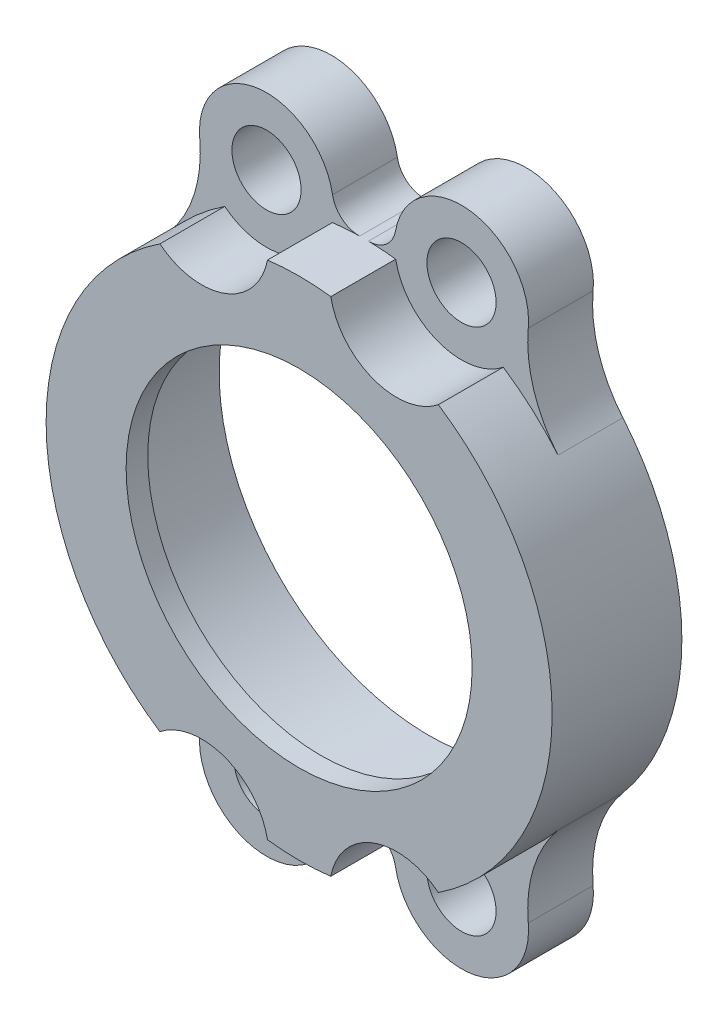
ISO-10303-21;
HEADER;
FILE_DESCRIPTION(('STEP AP214'),'2;1');
FILE_NAME('part.step','',(''),(''),'','','');
FILE_SCHEMA(('AUTOMOTIVE_DESIGN { 1 0 10303 214 1 1 1 1 }'));
ENDSEC;
DATA;
#1=APPLICATION_CONTEXT('core data for automotive mechanical design processes');
#2=APPLICATION_PROTOCOL_DEFINITION('international standard','automotive_design',2000,#1);
#3=PRODUCT_CONTEXT('',#1,'mechanical');
#4=PRODUCT('Part','Part','',(#3));
#5=PRODUCT_RELATED_PRODUCT_CATEGORY('part','',(#4));
#6=PRODUCT_DEFINITION_FORMATION('','',#4);
#7=PRODUCT_DEFINITION_CONTEXT('part definition',#1,'design');
#8=PRODUCT_DEFINITION('design','',#6,#7);
#9=PRODUCT_DEFINITION_SHAPE('','',#8);
#10=(LENGTH_UNIT() NAMED_UNIT(*) SI_UNIT(.MILLI.,.METRE.));
#11=(NAMED_UNIT(*) PLANE_ANGLE_UNIT() SI_UNIT($,.RADIAN.));
#12=(NAMED_UNIT(*) SI_UNIT($,.STERADIAN.) SOLID_ANGLE_UNIT());
#13=UNCERTAINTY_MEASURE_WITH_UNIT(LENGTH_MEASURE(1.E-05),#10,'distance_accuracy_value','');
#14=(GEOMETRIC_REPRESENTATION_CONTEXT(3) GLOBAL_UNCERTAINTY_ASSIGNED_CONTEXT((#13)) GLOBAL_UNIT_ASSIGNED_CONTEXT((#10,
#11,#12)) REPRESENTATION_CONTEXT('',''));
#15=CARTESIAN_POINT('',(0.,0.,0.));
#16=DIRECTION('',(0.,0.,1.));
#17=DIRECTION('',(1.,0.,0.));
#18=AXIS2_PLACEMENT_3D('',#15,#16,#17);
#19=CARTESIAN_POINT('',(-4.50880281690145,-12.1930593846788,-5.));
#20=DIRECTION('',(0.,0.,1.));
#21=DIRECTION('',(1.,0.,0.));
#22=AXIS2_PLACEMENT_3D('',#19,#20,#21);
#23=CYLINDRICAL_SURFACE('',#22,3.1);
#24=DIRECTION('',(0.,0.,1.));
#25=VECTOR('',#24,1.);
#26=CARTESIAN_POINT('',(-1.45585096363241,-12.7310974703392,-5.));
#27=LINE('',#26,#25);
#28=CARTESIAN_POINT('',(-1.45585096363241,-12.7310974703392,-5.));
#29=VERTEX_POINT('',#28);
#30=CARTESIAN_POINT('',(-1.45585096363241,-12.7310974703392,-2.));
#31=VERTEX_POINT('',#30);
#32=EDGE_CURVE('E230',#29,#31,#27,.T.);
#33=ORIENTED_EDGE('',*,*,#32,.T.);
#34=CARTESIAN_POINT('',(-4.50880281690145,-12.1930593846788,-2.));
#35=DIRECTION('',(0.,0.,1.));
#36=DIRECTION('',(1.,0.,0.));
#37=AXIS2_PLACEMENT_3D('',#34,#35,#36);
#38=CIRCLE('',#37,3.1);
#39=CARTESIAN_POINT('',(-7.59588423001124,-11.9103433631447,-2.));
#40=VERTEX_POINT('',#39);
#41=EDGE_CURVE('E268',#40,#31,#38,.T.);
#42=ORIENTED_EDGE('',*,*,#41,.F.);
#43=DIRECTION('',(0.,0.,1.));
#44=VECTOR('',#43,1.);
#45=CARTESIAN_POINT('',(-7.59588423001124,-11.9103433631447,-5.));
#46=LINE('',#45,#44);
#47=CARTESIAN_POINT('',(-7.59588423001124,-11.9103433631447,-5.));
#48=VERTEX_POINT('',#47);
#49=EDGE_CURVE('E259',#40,#48,#46,.F.);
#50=ORIENTED_EDGE('',*,*,#49,.T.);
#51=CARTESIAN_POINT('',(-4.50880281690145,-12.1930593846788,-5.));
#52=DIRECTION('',(0.,0.,1.));
#53=DIRECTION('',(1.,0.,0.));
#54=AXIS2_PLACEMENT_3D('',#51,#52,#53);
#55=CIRCLE('',#54,3.1);
#56=EDGE_CURVE('E249',#48,#29,#55,.T.);
#57=ORIENTED_EDGE('',*,*,#56,.T.);
#58=EDGE_LOOP('',(#33,#42,#50,#57));
#59=FACE_BOUND('',#58,.T.);
#60=ADVANCED_FACE('F34',(#59),#23,.T.);
#61=CARTESIAN_POINT('',(-4.50880281690145,12.1930593846787,-5.));
#62=DIRECTION('',(0.,0.,1.));
#63=DIRECTION('',(1.,0.,0.));
#64=AXIS2_PLACEMENT_3D('',#61,#62,#63);
#65=CYLINDRICAL_SURFACE('',#64,3.1);
#66=DIRECTION('',(0.,0.,1.));
#67=VECTOR('',#66,1.);
#68=CARTESIAN_POINT('',(-7.59588423001125,11.9103433631446,-5.));
#69=LINE('',#68,#67);
#70=CARTESIAN_POINT('',(-7.59588423001125,11.9103433631446,-5.));
#71=VERTEX_POINT('',#70);
#72=CARTESIAN_POINT('',(-7.59588423001124,11.9103433631446,-2.));
#73=VERTEX_POINT('',#72);
#74=EDGE_CURVE('E370',#71,#73,#69,.T.);
#75=ORIENTED_EDGE('',*,*,#74,.T.);
#76=CARTESIAN_POINT('',(-4.50880281690145,12.1930593846787,-2.));
#77=DIRECTION('',(0.,0.,1.));
#78=DIRECTION('',(1.,0.,0.));
#79=AXIS2_PLACEMENT_3D('',#76,#77,#78);
#80=CIRCLE('',#79,3.1);
#81=CARTESIAN_POINT('',(-1.45585096363242,12.7310974703392,-2.));
#82=VERTEX_POINT('',#81);
#83=EDGE_CURVE('E433',#82,#73,#80,.T.);
#84=ORIENTED_EDGE('',*,*,#83,.F.);
#85=DIRECTION('',(0.,0.,1.));
#86=VECTOR('',#85,1.);
#87=CARTESIAN_POINT('',(-1.45585096363242,12.7310974703392,-5.));
#88=LINE('',#87,#86);
#89=CARTESIAN_POINT('',(-1.45585096363242,12.7310974703392,-5.));
#90=VERTEX_POINT('',#89);
#91=EDGE_CURVE('E220',#82,#90,#88,.F.);
#92=ORIENTED_EDGE('',*,*,#91,.T.);
#93=CARTESIAN_POINT('',(-4.50880281690145,12.1930593846787,-5.));
#94=DIRECTION('',(0.,0.,1.));
#95=DIRECTION('',(1.,0.,0.));
#96=AXIS2_PLACEMENT_3D('',#93,#94,#95);
#97=CIRCLE('',#96,3.1);
#98=EDGE_CURVE('E343',#90,#71,#97,.T.);
#99=ORIENTED_EDGE('',*,*,#98,.T.);
#100=EDGE_LOOP('',(#75,#84,#92,#99));
#101=FACE_BOUND('',#100,.T.);
#102=ADVANCED_FACE('F516',(#101),#65,.T.);
#103=CARTESIAN_POINT('',(4.50880281690123,12.1930593846787,-5.));
#104=DIRECTION('',(0.,0.,1.));
#105=DIRECTION('',(1.,0.,0.));
#106=AXIS2_PLACEMENT_3D('',#103,#104,#105);
#107=CYLINDRICAL_SURFACE('',#106,3.1);
#108=DIRECTION('',(0.,0.,1.));
#109=VECTOR('',#108,1.);
#110=CARTESIAN_POINT('',(1.4558509636322,12.7310974703392,-5.));
#111=LINE('',#110,#109);
#112=CARTESIAN_POINT('',(1.4558509636322,12.7310974703392,-5.));
#113=VERTEX_POINT('',#112);
#114=CARTESIAN_POINT('',(1.4558509636322,12.7310974703392,-2.));
#115=VERTEX_POINT('',#114);
#116=EDGE_CURVE('E228',#113,#115,#111,.T.);
#117=ORIENTED_EDGE('',*,*,#116,.T.);
#118=CARTESIAN_POINT('',(4.50880281690123,12.1930593846787,-2.));
#119=DIRECTION('',(0.,0.,1.));
#120=DIRECTION('',(1.,0.,0.));
#121=AXIS2_PLACEMENT_3D('',#118,#119,#120);
#122=CIRCLE('',#121,3.1);
#123=CARTESIAN_POINT('',(7.59588423001103,11.9103433631447,-2.));
#124=VERTEX_POINT('',#123);
#125=EDGE_CURVE('E57',#124,#115,#122,.T.);
#126=ORIENTED_EDGE('',*,*,#125,.F.);
#127=DIRECTION('',(0.,0.,1.));
#128=VECTOR('',#127,1.);
#129=CARTESIAN_POINT('',(7.59588423001103,11.9103433631447,-5.));
#130=LINE('',#129,#128);
#131=CARTESIAN_POINT('',(7.59588423001103,11.9103433631447,-5.));
#132=VERTEX_POINT('',#131);
#133=EDGE_CURVE('E368',#124,#132,#130,.F.);
#134=ORIENTED_EDGE('',*,*,#133,.T.);
#135=CARTESIAN_POINT('',(4.50880281690123,12.1930593846787,-5.));
#136=DIRECTION('',(0.,0.,1.));
#137=DIRECTION('',(1.,0.,0.));
#138=AXIS2_PLACEMENT_3D('',#135,#136,#137);
#139=CIRCLE('',#138,3.1);
#140=EDGE_CURVE('E340',#132,#113,#139,.T.);
#141=ORIENTED_EDGE('',*,*,#140,.T.);
#142=EDGE_LOOP('',(#117,#126,#134,#141));
#143=FACE_BOUND('',#142,.T.);
#144=ADVANCED_FACE('F521',(#143),#107,.T.);
#145=CARTESIAN_POINT('',(4.50880281690123,-12.1930593846788,-5.));
#146=DIRECTION('',(0.,0.,1.));
#147=DIRECTION('',(1.,0.,0.));
#148=AXIS2_PLACEMENT_3D('',#145,#146,#147);
#149=CYLINDRICAL_SURFACE('',#148,3.1);
#150=DIRECTION('',(0.,0.,1.));
#151=VECTOR('',#150,1.);
#152=CARTESIAN_POINT('',(7.59588423001103,-11.9103433631448,-5.));
#153=LINE('',#152,#151);
#154=CARTESIAN_POINT('',(7.59588423001103,-11.9103433631448,-5.));
#155=VERTEX_POINT('',#154);
#156=CARTESIAN_POINT('',(7.59588423001103,-11.9103433631448,-2.));
#157=VERTEX_POINT('',#156);
#158=EDGE_CURVE('E379',#155,#157,#153,.T.);
#159=ORIENTED_EDGE('',*,*,#158,.T.);
#160=CARTESIAN_POINT('',(4.50880281690123,-12.1930593846788,-2.));
#161=DIRECTION('',(0.,0.,1.));
#162=DIRECTION('',(1.,0.,0.));
#163=AXIS2_PLACEMENT_3D('',#160,#161,#162);
#164=CIRCLE('',#163,3.1);
#165=CARTESIAN_POINT('',(1.45585096363219,-12.7310974703392,-2.));
#166=VERTEX_POINT('',#165);
#167=EDGE_CURVE('E457',#166,#157,#164,.T.);
#168=ORIENTED_EDGE('',*,*,#167,.F.);
#169=DIRECTION('',(0.,0.,1.));
#170=VECTOR('',#169,1.);
#171=CARTESIAN_POINT('',(1.45585096363219,-12.7310974703392,-5.));
#172=LINE('',#171,#170);
#173=CARTESIAN_POINT('',(1.45585096363219,-12.7310974703392,-5.));
#174=VERTEX_POINT('',#173);
#175=EDGE_CURVE('E238',#166,#174,#172,.F.);
#176=ORIENTED_EDGE('',*,*,#175,.T.);
#177=CARTESIAN_POINT('',(4.50880281690123,-12.1930593846788,-5.));
#178=DIRECTION('',(0.,0.,1.));
#179=DIRECTION('',(1.,0.,0.));
#180=AXIS2_PLACEMENT_3D('',#177,#178,#179);
#181=CIRCLE('',#180,3.1);
#182=EDGE_CURVE('E336',#174,#155,#181,.T.);
#183=ORIENTED_EDGE('',*,*,#182,.T.);
#184=EDGE_LOOP('',(#159,#168,#176,#183));
#185=FACE_BOUND('',#184,.T.);
#186=ADVANCED_FACE('F481',(#185),#149,.T.);
#187=CARTESIAN_POINT('',(-4.50880281690145,12.1930593846787,-5.));
#188=DIRECTION('',(0.,0.,1.));
#189=DIRECTION('',(1.,0.,0.));
#190=AXIS2_PLACEMENT_3D('',#187,#188,#189);
#191=CYLINDRICAL_SURFACE('',#190,1.6);
#192=CARTESIAN_POINT('',(-4.50880281690145,12.1930593846787,-5.));
#193=DIRECTION('',(0.,0.,1.));
#194=DIRECTION('',(1.,0.,0.));
#195=AXIS2_PLACEMENT_3D('',#192,#193,#194);
#196=CIRCLE('',#195,1.6);
#197=CARTESIAN_POINT('',(-2.90880281690145,12.1930593846787,-5.));
#198=VERTEX_POINT('',#197);
#199=EDGE_CURVE('E355',#198,#198,#196,.T.);
#200=ORIENTED_EDGE('',*,*,#199,.F.);
#201=EDGE_LOOP('',(#200));
#202=FACE_BOUND('',#201,.T.);
#203=CARTESIAN_POINT('',(-4.50880281690145,12.1930593846787,-2.));
#204=DIRECTION('',(0.,0.,1.));
#205=DIRECTION('',(1.,0.,0.));
#206=AXIS2_PLACEMENT_3D('',#203,#204,#205);
#207=CIRCLE('',#206,1.6);
#208=CARTESIAN_POINT('',(-2.90880281690145,12.1930593846787,-2.));
#209=VERTEX_POINT('',#208);
#210=EDGE_CURVE('E294',#209,#209,#207,.F.);
#211=ORIENTED_EDGE('',*,*,#210,.F.);
#212=EDGE_LOOP('',(#211));
#213=FACE_BOUND('',#212,.T.);
#214=ADVANCED_FACE('F511',(#202,#213),#191,.F.);
#215=CARTESIAN_POINT('',(4.50880281690123,12.1930593846787,-5.));
#216=DIRECTION('',(0.,0.,1.));
#217=DIRECTION('',(1.,0.,0.));
#218=AXIS2_PLACEMENT_3D('',#215,#216,#217);
#219=CYLINDRICAL_SURFACE('',#218,1.6);
#220=CARTESIAN_POINT('',(4.50880281690123,12.1930593846787,-5.));
#221=DIRECTION('',(0.,0.,1.));
#222=DIRECTION('',(1.,0.,0.));
#223=AXIS2_PLACEMENT_3D('',#220,#221,#222);
#224=CIRCLE('',#223,1.6);
#225=CARTESIAN_POINT('',(6.10880281690124,12.1930593846787,-5.));
#226=VERTEX_POINT('',#225);
#227=EDGE_CURVE('E352',#226,#226,#224,.T.);
#228=ORIENTED_EDGE('',*,*,#227,.F.);
#229=EDGE_LOOP('',(#228));
#230=FACE_BOUND('',#229,.T.);
#231=CARTESIAN_POINT('',(4.50880281690123,12.1930593846787,-2.));
#232=DIRECTION('',(0.,0.,1.));
#233=DIRECTION('',(1.,0.,0.));
#234=AXIS2_PLACEMENT_3D('',#231,#232,#233);
#235=CIRCLE('',#234,1.6);
#236=CARTESIAN_POINT('',(6.10880281690124,12.1930593846787,-2.));
#237=VERTEX_POINT('',#236);
#238=EDGE_CURVE('E291',#237,#237,#235,.F.);
#239=ORIENTED_EDGE('',*,*,#238,.F.);
#240=EDGE_LOOP('',(#239));
#241=FACE_BOUND('',#240,.T.);
#242=ADVANCED_FACE('F502',(#230,#241),#219,.F.);
#243=CARTESIAN_POINT('',(4.50880281690123,-12.1930593846788,-5.));
#244=DIRECTION('',(0.,0.,1.));
#245=DIRECTION('',(1.,0.,0.));
#246=AXIS2_PLACEMENT_3D('',#243,#244,#245);
#247=CYLINDRICAL_SURFACE('',#246,1.6);
#248=CARTESIAN_POINT('',(4.50880281690123,-12.1930593846788,-5.));
#249=DIRECTION('',(0.,0.,1.));
#250=DIRECTION('',(1.,0.,0.));
#251=AXIS2_PLACEMENT_3D('',#248,#249,#250);
#252=CIRCLE('',#251,1.6);
#253=CARTESIAN_POINT('',(6.10880281690124,-12.1930593846788,-5.));
#254=VERTEX_POINT('',#253);
#255=EDGE_CURVE('E349',#254,#254,#252,.T.);
#256=ORIENTED_EDGE('',*,*,#255,.F.);
#257=EDGE_LOOP('',(#256));
#258=FACE_BOUND('',#257,.T.);
#259=CARTESIAN_POINT('',(4.50880281690123,-12.1930593846788,-2.));
#260=DIRECTION('',(0.,0.,1.));
#261=DIRECTION('',(1.,0.,0.));
#262=AXIS2_PLACEMENT_3D('',#259,#260,#261);
#263=CIRCLE('',#262,1.6);
#264=CARTESIAN_POINT('',(6.10880281690124,-12.1930593846788,-2.));
#265=VERTEX_POINT('',#264);
#266=EDGE_CURVE('E285',#265,#265,#263,.F.);
#267=ORIENTED_EDGE('',*,*,#266,.F.);
#268=EDGE_LOOP('',(#267));
#269=FACE_BOUND('',#268,.T.);
#270=ADVANCED_FACE('F499',(#258,#269),#247,.F.);
#271=CARTESIAN_POINT('',(-4.50880281690145,-12.1930593846788,-5.));
#272=DIRECTION('',(0.,0.,1.));
#273=DIRECTION('',(1.,0.,0.));
#274=AXIS2_PLACEMENT_3D('',#271,#272,#273);
#275=CYLINDRICAL_SURFACE('',#274,1.5);
#276=CARTESIAN_POINT('',(-4.50880281690145,-12.1930593846788,-5.));
#277=DIRECTION('',(0.,0.,1.));
#278=DIRECTION('',(1.,0.,0.));
#279=AXIS2_PLACEMENT_3D('',#276,#277,#278);
#280=CIRCLE('',#279,1.5);
#281=CARTESIAN_POINT('',(-3.00880281690145,-12.1930593846788,-5.));
#282=VERTEX_POINT('',#281);
#283=EDGE_CURVE('E346',#282,#282,#280,.T.);
#284=ORIENTED_EDGE('',*,*,#283,.F.);
#285=EDGE_LOOP('',(#284));
#286=FACE_BOUND('',#285,.T.);
#287=CARTESIAN_POINT('',(-4.50880281690145,-12.1930593846788,-2.));
#288=DIRECTION('',(0.,0.,1.));
#289=DIRECTION('',(1.,0.,0.));
#290=AXIS2_PLACEMENT_3D('',#287,#288,#289);
#291=CIRCLE('',#290,1.5);
#292=CARTESIAN_POINT('',(-3.00880281690145,-12.1930593846788,-2.));
#293=VERTEX_POINT('',#292);
#294=EDGE_CURVE('E288',#293,#293,#291,.F.);
#295=ORIENTED_EDGE('',*,*,#294,.F.);
#296=EDGE_LOOP('',(#295));
#297=FACE_BOUND('',#296,.T.);
#298=ADVANCED_FACE('F501',(#286,#297),#275,.F.);
#299=CARTESIAN_POINT('',(13.5708805134493,11.3631510634014,-5.));
#300=DIRECTION('',(0.,0.,-1.));
#301=DIRECTION('',(-1.,0.,0.));
#302=AXIS2_PLACEMENT_3D('',#299,#300,#301);
#303=CYLINDRICAL_SURFACE('',#302,6.);
#304=CARTESIAN_POINT('',(13.5708805134493,11.3631510634014,-2.));
#305=DIRECTION('',(0.,0.,1.));
#306=DIRECTION('',(1.,0.,0.));
#307=AXIS2_PLACEMENT_3D('',#304,#305,#306);
#308=CIRCLE('',#307,6.);
#309=CARTESIAN_POINT('',(8.97058203431397,7.51123544868907,-2.));
#310=VERTEX_POINT('',#309);
#311=EDGE_CURVE('E460',#124,#310,#308,.T.);
#312=ORIENTED_EDGE('',*,*,#311,.T.);
#313=DIRECTION('',(0.,0.,1.));
#314=VECTOR('',#313,1.);
#315=CARTESIAN_POINT('',(8.97058203431397,7.51123544868908,-5.));
#316=LINE('',#315,#314);
#317=CARTESIAN_POINT('',(8.97058203431397,7.51123544868908,-5.));
#318=VERTEX_POINT('',#317);
#319=EDGE_CURVE('E365',#318,#310,#316,.T.);
#320=ORIENTED_EDGE('',*,*,#319,.F.);
#321=CARTESIAN_POINT('',(13.5708805134493,11.3631510634014,-5.));
#322=DIRECTION('',(0.,0.,1.));
#323=DIRECTION('',(1.,0.,0.));
#324=AXIS2_PLACEMENT_3D('',#321,#322,#323);
#325=CIRCLE('',#324,6.);
#326=EDGE_CURVE('E382',#132,#318,#325,.T.);
#327=ORIENTED_EDGE('',*,*,#326,.F.);
#328=ORIENTED_EDGE('',*,*,#133,.F.);
#329=EDGE_LOOP('',(#312,#320,#327,#328));
#330=FACE_BOUND('',#329,.T.);
#331=ADVANCED_FACE('F467',(#330),#303,.F.);
#332=CARTESIAN_POINT('',(-13.5708805134495,11.3631510634012,-5.));
#333=DIRECTION('',(0.,0.,-1.));
#334=DIRECTION('',(-1.,0.,0.));
#335=AXIS2_PLACEMENT_3D('',#332,#333,#334);
#336=CYLINDRICAL_SURFACE('',#335,6.);
#337=CARTESIAN_POINT('',(-13.5708805134495,11.3631510634012,-2.));
#338=DIRECTION('',(0.,0.,1.));
#339=DIRECTION('',(1.,0.,0.));
#340=AXIS2_PLACEMENT_3D('',#337,#338,#339);
#341=CIRCLE('',#340,6.);
#342=CARTESIAN_POINT('',(-8.97058203431411,7.51123544868892,-2.));
#343=VERTEX_POINT('',#342);
#344=EDGE_CURVE('E431',#343,#73,#341,.T.);
#345=ORIENTED_EDGE('',*,*,#344,.T.);
#346=ORIENTED_EDGE('',*,*,#74,.F.);
#347=CARTESIAN_POINT('',(-13.5708805134495,11.3631510634012,-5.));
#348=DIRECTION('',(0.,0.,1.));
#349=DIRECTION('',(1.,0.,0.));
#350=AXIS2_PLACEMENT_3D('',#347,#348,#349);
#351=CIRCLE('',#350,6.);
#352=CARTESIAN_POINT('',(-8.97058203431411,7.51123544868892,-5.));
#353=VERTEX_POINT('',#352);
#354=EDGE_CURVE('E384',#353,#71,#351,.T.);
#355=ORIENTED_EDGE('',*,*,#354,.F.);
#356=DIRECTION('',(0.,0.,1.));
#357=VECTOR('',#356,1.);
#358=CARTESIAN_POINT('',(-8.97058203431411,7.51123544868892,-5.));
#359=LINE('',#358,#357);
#360=EDGE_CURVE('E376',#343,#353,#359,.F.);
#361=ORIENTED_EDGE('',*,*,#360,.F.);
#362=EDGE_LOOP('',(#345,#346,#355,#361));
#363=FACE_BOUND('',#362,.T.);
#364=ADVANCED_FACE('F529',(#363),#336,.F.);
#365=CARTESIAN_POINT('',(-13.5708805134495,-11.3631510634012,-5.));
#366=DIRECTION('',(0.,0.,-1.));
#367=DIRECTION('',(-1.,0.,0.));
#368=AXIS2_PLACEMENT_3D('',#365,#366,#367);
#369=CYLINDRICAL_SURFACE('',#368,6.);
#370=CARTESIAN_POINT('',(-13.5708805134495,-11.3631510634012,-2.));
#371=DIRECTION('',(0.,0.,1.));
#372=DIRECTION('',(1.,0.,0.));
#373=AXIS2_PLACEMENT_3D('',#370,#371,#372);
#374=CIRCLE('',#373,6.);
#375=CARTESIAN_POINT('',(-8.97058203431411,-7.51123544868891,-2.));
#376=VERTEX_POINT('',#375);
#377=EDGE_CURVE('E271',#40,#376,#374,.T.);
#378=ORIENTED_EDGE('',*,*,#377,.T.);
#379=DIRECTION('',(0.,0.,1.));
#380=VECTOR('',#379,1.);
#381=CARTESIAN_POINT('',(-8.9705820343141,-7.51123544868892,-5.));
#382=LINE('',#381,#380);
#383=CARTESIAN_POINT('',(-8.9705820343141,-7.51123544868892,-5.));
#384=VERTEX_POINT('',#383);
#385=EDGE_CURVE('E373',#384,#376,#382,.T.);
#386=ORIENTED_EDGE('',*,*,#385,.F.);
#387=CARTESIAN_POINT('',(-13.5708805134495,-11.3631510634012,-5.));
#388=DIRECTION('',(0.,0.,1.));
#389=DIRECTION('',(1.,0.,0.));
#390=AXIS2_PLACEMENT_3D('',#387,#388,#389);
#391=CIRCLE('',#390,6.);
#392=EDGE_CURVE('E223',#48,#384,#391,.T.);
#393=ORIENTED_EDGE('',*,*,#392,.F.);
#394=ORIENTED_EDGE('',*,*,#49,.F.);
#395=EDGE_LOOP('',(#378,#386,#393,#394));
#396=FACE_BOUND('',#395,.T.);
#397=ADVANCED_FACE('F394',(#396),#369,.F.);
#398=CARTESIAN_POINT('',(13.5708805134493,-11.3631510634014,-5.));
#399=DIRECTION('',(0.,0.,-1.));
#400=DIRECTION('',(-1.,0.,0.));
#401=AXIS2_PLACEMENT_3D('',#398,#399,#400);
#402=CYLINDRICAL_SURFACE('',#401,6.);
#403=CARTESIAN_POINT('',(13.5708805134493,-11.3631510634014,-2.));
#404=DIRECTION('',(0.,0.,1.));
#405=DIRECTION('',(1.,0.,0.));
#406=AXIS2_PLACEMENT_3D('',#403,#404,#405);
#407=CIRCLE('',#406,6.);
#408=CARTESIAN_POINT('',(8.97058203431397,-7.51123544868908,-2.));
#409=VERTEX_POINT('',#408);
#410=EDGE_CURVE('E454',#409,#157,#407,.T.);
#411=ORIENTED_EDGE('',*,*,#410,.T.);
#412=ORIENTED_EDGE('',*,*,#158,.F.);
#413=CARTESIAN_POINT('',(13.5708805134493,-11.3631510634014,-5.));
#414=DIRECTION('',(0.,0.,1.));
#415=DIRECTION('',(1.,0.,0.));
#416=AXIS2_PLACEMENT_3D('',#413,#414,#415);
#417=CIRCLE('',#416,6.);
#418=CARTESIAN_POINT('',(8.97058203431397,-7.51123544868908,-5.));
#419=VERTEX_POINT('',#418);
#420=EDGE_CURVE('E217',#419,#155,#417,.T.);
#421=ORIENTED_EDGE('',*,*,#420,.F.);
#422=DIRECTION('',(0.,0.,1.));
#423=VECTOR('',#422,1.);
#424=CARTESIAN_POINT('',(8.97058203431397,-7.51123544868908,-5.));
#425=LINE('',#424,#423);
#426=EDGE_CURVE('E361',#409,#419,#425,.F.);
#427=ORIENTED_EDGE('',*,*,#426,.F.);
#428=EDGE_LOOP('',(#411,#412,#421,#427));
#429=FACE_BOUND('',#428,.T.);
#430=ADVANCED_FACE('F477',(#429),#402,.F.);
#431=CARTESIAN_POINT('',(-0.224821990540071,12.9480483113313,-5.));
#432=DIRECTION('',(0.,0.,-1.));
#433=DIRECTION('',(-1.,0.,0.));
#434=AXIS2_PLACEMENT_3D('',#431,#432,#433);
#435=CYLINDRICAL_SURFACE('',#434,1.25);
#436=CARTESIAN_POINT('',(-0.224821990540071,12.9480483113313,-2.));
#437=DIRECTION('',(0.,0.,1.));
#438=DIRECTION('',(1.,0.,0.));
#439=AXIS2_PLACEMENT_3D('',#436,#437,#438);
#440=CIRCLE('',#439,1.25);
#441=CARTESIAN_POINT('',(-0.203121026202226,11.6982366982684,-2.));
#442=VERTEX_POINT('',#441);
#443=EDGE_CURVE('E438',#82,#442,#440,.T.);
#444=ORIENTED_EDGE('',*,*,#443,.T.);
#445=DIRECTION('',(0.,0.,1.));
#446=VECTOR('',#445,1.);
#447=CARTESIAN_POINT('',(-0.203121026202226,11.6982366982684,-5.));
#448=LINE('',#447,#446);
#449=CARTESIAN_POINT('',(-0.203121026202226,11.6982366982684,-5.));
#450=VERTEX_POINT('',#449);
#451=EDGE_CURVE('E216',#450,#442,#448,.T.);
#452=ORIENTED_EDGE('',*,*,#451,.F.);
#453=CARTESIAN_POINT('',(-0.224821990540071,12.9480483113313,-5.));
#454=DIRECTION('',(0.,0.,1.));
#455=DIRECTION('',(1.,0.,0.));
#456=AXIS2_PLACEMENT_3D('',#453,#454,#455);
#457=CIRCLE('',#456,1.25);
#458=EDGE_CURVE('E240',#90,#450,#457,.T.);
#459=ORIENTED_EDGE('',*,*,#458,.F.);
#460=ORIENTED_EDGE('',*,*,#91,.F.);
#461=EDGE_LOOP('',(#444,#452,#459,#460));
#462=FACE_BOUND('',#461,.T.);
#463=ADVANCED_FACE('F537',(#462),#435,.F.);
#464=CARTESIAN_POINT('',(0.224821990539853,12.9480483113313,-5.));
#465=DIRECTION('',(0.,0.,-1.));
#466=DIRECTION('',(-1.,0.,0.));
#467=AXIS2_PLACEMENT_3D('',#464,#465,#466);
#468=CYLINDRICAL_SURFACE('',#467,1.25);
#469=CARTESIAN_POINT('',(0.224821990539853,12.9480483113313,-2.));
#470=DIRECTION('',(0.,0.,1.));
#471=DIRECTION('',(1.,0.,0.));
#472=AXIS2_PLACEMENT_3D('',#469,#470,#471);
#473=CIRCLE('',#472,1.25);
#474=CARTESIAN_POINT('',(0.203121026202029,11.6982366982684,-2.));
#475=VERTEX_POINT('',#474);
#476=EDGE_CURVE('E193',#475,#115,#473,.T.);
#477=ORIENTED_EDGE('',*,*,#476,.T.);
#478=ORIENTED_EDGE('',*,*,#116,.F.);
#479=CARTESIAN_POINT('',(0.224821990539853,12.9480483113313,-5.));
#480=DIRECTION('',(0.,0.,1.));
#481=DIRECTION('',(1.,0.,0.));
#482=AXIS2_PLACEMENT_3D('',#479,#480,#481);
#483=CIRCLE('',#482,1.25);
#484=CARTESIAN_POINT('',(0.20312102620203,11.6982366982684,-5.));
#485=VERTEX_POINT('',#484);
#486=EDGE_CURVE('E215',#485,#113,#483,.T.);
#487=ORIENTED_EDGE('',*,*,#486,.F.);
#488=DIRECTION('',(0.,0.,1.));
#489=VECTOR('',#488,1.);
#490=CARTESIAN_POINT('',(0.20312102620203,11.6982366982684,-5.));
#491=LINE('',#490,#489);
#492=EDGE_CURVE('E208',#475,#485,#491,.F.);
#493=ORIENTED_EDGE('',*,*,#492,.F.);
#494=EDGE_LOOP('',(#477,#478,#487,#493));
#495=FACE_BOUND('',#494,.T.);
#496=ADVANCED_FACE('F214',(#495),#468,.F.);
#497=CARTESIAN_POINT('',(-0.224821990540053,-12.9480483113313,-5.));
#498=DIRECTION('',(0.,0.,-1.));
#499=DIRECTION('',(-1.,0.,0.));
#500=AXIS2_PLACEMENT_3D('',#497,#498,#499);
#501=CYLINDRICAL_SURFACE('',#500,1.25);
#502=CARTESIAN_POINT('',(-0.224821990540053,-12.9480483113313,-2.));
#503=DIRECTION('',(0.,0.,1.));
#504=DIRECTION('',(1.,0.,0.));
#505=AXIS2_PLACEMENT_3D('',#502,#503,#504);
#506=CIRCLE('',#505,1.25);
#507=CARTESIAN_POINT('',(-0.203121026202219,-11.6982366982684,-2.));
#508=VERTEX_POINT('',#507);
#509=EDGE_CURVE('E264',#508,#31,#506,.T.);
#510=ORIENTED_EDGE('',*,*,#509,.T.);
#511=ORIENTED_EDGE('',*,*,#32,.F.);
#512=CARTESIAN_POINT('',(-0.224821990540053,-12.9480483113313,-5.));
#513=DIRECTION('',(0.,0.,1.));
#514=DIRECTION('',(1.,0.,0.));
#515=AXIS2_PLACEMENT_3D('',#512,#513,#514);
#516=CIRCLE('',#515,1.25);
#517=CARTESIAN_POINT('',(-0.20312102620221,-11.6982366982684,-5.));
#518=VERTEX_POINT('',#517);
#519=EDGE_CURVE('E42',#518,#29,#516,.T.);
#520=ORIENTED_EDGE('',*,*,#519,.F.);
#521=DIRECTION('',(0.,0.,1.));
#522=VECTOR('',#521,1.);
#523=CARTESIAN_POINT('',(-0.20312102620221,-11.6982366982684,-5.));
#524=LINE('',#523,#522);
#525=EDGE_CURVE('E236',#508,#518,#524,.F.);
#526=ORIENTED_EDGE('',*,*,#525,.F.);
#527=EDGE_LOOP('',(#510,#511,#520,#526));
#528=FACE_BOUND('',#527,.T.);
#529=ADVANCED_FACE('F263',(#528),#501,.F.);
#530=CARTESIAN_POINT('',(0.224821990539831,-12.9480483113313,-5.));
#531=DIRECTION('',(0.,0.,-1.));
#532=DIRECTION('',(-1.,0.,0.));
#533=AXIS2_PLACEMENT_3D('',#530,#531,#532);
#534=CYLINDRICAL_SURFACE('',#533,1.25);
#535=CARTESIAN_POINT('',(0.224821990539831,-12.9480483113313,-2.));
#536=DIRECTION('',(0.,0.,1.));
#537=DIRECTION('',(1.,0.,0.));
#538=AXIS2_PLACEMENT_3D('',#535,#536,#537);
#539=CIRCLE('',#538,1.25);
#540=CARTESIAN_POINT('',(0.203121026202009,-11.6982366982684,-2.));
#541=VERTEX_POINT('',#540);
#542=EDGE_CURVE('E273',#166,#541,#539,.T.);
#543=ORIENTED_EDGE('',*,*,#542,.T.);
#544=DIRECTION('',(0.,0.,1.));
#545=VECTOR('',#544,1.);
#546=CARTESIAN_POINT('',(0.203121026202009,-11.6982366982684,-5.));
#547=LINE('',#546,#545);
#548=CARTESIAN_POINT('',(0.203121026202009,-11.6982366982684,-5.));
#549=VERTEX_POINT('',#548);
#550=EDGE_CURVE('E233',#549,#541,#547,.T.);
#551=ORIENTED_EDGE('',*,*,#550,.F.);
#552=CARTESIAN_POINT('',(0.224821990539831,-12.9480483113313,-5.));
#553=DIRECTION('',(0.,0.,1.));
#554=DIRECTION('',(1.,0.,0.));
#555=AXIS2_PLACEMENT_3D('',#552,#553,#554);
#556=CIRCLE('',#555,1.25);
#557=EDGE_CURVE('E11',#174,#549,#556,.T.);
#558=ORIENTED_EDGE('',*,*,#557,.F.);
#559=ORIENTED_EDGE('',*,*,#175,.F.);
#560=EDGE_LOOP('',(#543,#551,#558,#559));
#561=FACE_BOUND('',#560,.T.);
#562=ADVANCED_FACE('F36',(#561),#534,.F.);
#563=CARTESIAN_POINT('',(0.,0.,-5.));
#564=DIRECTION('',(0.,0.,1.));
#565=DIRECTION('',(1.,0.,0.));
#566=AXIS2_PLACEMENT_3D('',#563,#564,#565);
#567=CYLINDRICAL_SURFACE('',#566,11.7);
#568=CARTESIAN_POINT('',(0.,0.,-2.));
#569=DIRECTION('',(0.,0.,1.));
#570=DIRECTION('',(1.,0.,0.));
#571=AXIS2_PLACEMENT_3D('',#568,#569,#570);
#572=CIRCLE('',#571,11.7);
#573=CARTESIAN_POINT('',(-6.44002888592919,-9.76811281406995,-2.));
#574=VERTEX_POINT('',#573);
#575=EDGE_CURVE('E279',#376,#574,#572,.T.);
#576=ORIENTED_EDGE('',*,*,#575,.T.);
#577=DIRECTION('',(0.,0.,-1.));
#578=VECTOR('',#577,1.);
#579=CARTESIAN_POINT('',(-6.44002888592919,-9.76811281406995,1.));
#580=LINE('',#579,#578);
#581=CARTESIAN_POINT('',(-6.44002888592919,-9.76811281406995,1.));
#582=VERTEX_POINT('',#581);
#583=EDGE_CURVE('E318',#582,#574,#580,.T.);
#584=ORIENTED_EDGE('',*,*,#583,.F.);
#585=CARTESIAN_POINT('',(0.,0.,1.));
#586=DIRECTION('',(0.,0.,1.));
#587=DIRECTION('',(1.,0.,0.));
#588=AXIS2_PLACEMENT_3D('',#585,#586,#587);
#589=CIRCLE('',#588,11.7);
#590=CARTESIAN_POINT('',(-6.44002888592927,9.7681128140699,1.));
#591=VERTEX_POINT('',#590);
#592=EDGE_CURVE('E304',#591,#582,#589,.T.);
#593=ORIENTED_EDGE('',*,*,#592,.F.);
#594=DIRECTION('',(0.,0.,-1.));
#595=VECTOR('',#594,1.);
#596=CARTESIAN_POINT('',(-6.44002888592927,9.7681128140699,1.));
#597=LINE('',#596,#595);
#598=CARTESIAN_POINT('',(-6.44002888592927,9.7681128140699,-2.));
#599=VERTEX_POINT('',#598);
#600=EDGE_CURVE('E322',#591,#599,#597,.T.);
#601=ORIENTED_EDGE('',*,*,#600,.T.);
#602=CARTESIAN_POINT('',(0.,0.,-2.));
#603=DIRECTION('',(0.,0.,1.));
#604=DIRECTION('',(1.,0.,0.));
#605=AXIS2_PLACEMENT_3D('',#602,#603,#604);
#606=CIRCLE('',#605,11.7);
#607=EDGE_CURVE('E426',#599,#343,#606,.T.);
#608=ORIENTED_EDGE('',*,*,#607,.T.);
#609=ORIENTED_EDGE('',*,*,#360,.T.);
#610=CARTESIAN_POINT('',(0.,0.,-5.));
#611=DIRECTION('',(0.,0.,1.));
#612=DIRECTION('',(1.,0.,0.));
#613=AXIS2_PLACEMENT_3D('',#610,#611,#612);
#614=CIRCLE('',#613,11.7);
#615=EDGE_CURVE('E345',#353,#384,#614,.T.);
#616=ORIENTED_EDGE('',*,*,#615,.T.);
#617=ORIENTED_EDGE('',*,*,#385,.T.);
#618=EDGE_LOOP('',(#576,#584,#593,#601,#608,#609,#616,#617));
#619=FACE_BOUND('',#618,.T.);
#620=ADVANCED_FACE('F392',(#619),#567,.T.);
#621=CARTESIAN_POINT('',(0.,0.,-2.));
#622=DIRECTION('',(0.,0.,1.));
#623=DIRECTION('',(1.,0.,0.));
#624=AXIS2_PLACEMENT_3D('',#621,#622,#623);
#625=CIRCLE('',#624,11.7);
#626=CARTESIAN_POINT('',(-1.46451607615099,11.6079796977207,-2.));
#627=VERTEX_POINT('',#626);
#628=EDGE_CURVE('E49',#442,#627,#625,.T.);
#629=ORIENTED_EDGE('',*,*,#628,.T.);
#630=DIRECTION('',(0.,0.,-1.));
#631=VECTOR('',#630,1.);
#632=CARTESIAN_POINT('',(-1.46451607615099,11.6079796977207,1.));
#633=LINE('',#632,#631);
#634=CARTESIAN_POINT('',(-1.46451607615099,11.6079796977207,1.));
#635=VERTEX_POINT('',#634);
#636=EDGE_CURVE('E324',#635,#627,#633,.T.);
#637=ORIENTED_EDGE('',*,*,#636,.F.);
#638=CARTESIAN_POINT('',(1.46451607615076,11.6079796977207,1.));
#639=VERTEX_POINT('',#638);
#640=EDGE_CURVE('E311',#639,#635,#589,.T.);
#641=ORIENTED_EDGE('',*,*,#640,.F.);
#642=DIRECTION('',(0.,0.,-1.));
#643=VECTOR('',#642,1.);
#644=CARTESIAN_POINT('',(1.46451607615076,11.6079796977207,1.));
#645=LINE('',#644,#643);
#646=CARTESIAN_POINT('',(1.46451607615076,11.6079796977207,-2.));
#647=VERTEX_POINT('',#646);
#648=EDGE_CURVE('E211',#639,#647,#645,.T.);
#649=ORIENTED_EDGE('',*,*,#648,.T.);
#650=CARTESIAN_POINT('',(0.,0.,-2.));
#651=DIRECTION('',(0.,0.,1.));
#652=DIRECTION('',(1.,0.,0.));
#653=AXIS2_PLACEMENT_3D('',#650,#651,#652);
#654=CIRCLE('',#653,11.7);
#655=EDGE_CURVE('E198',#647,#475,#654,.T.);
#656=ORIENTED_EDGE('',*,*,#655,.T.);
#657=ORIENTED_EDGE('',*,*,#492,.T.);
#658=EDGE_CURVE('E337',#485,#450,#614,.T.);
#659=ORIENTED_EDGE('',*,*,#658,.T.);
#660=ORIENTED_EDGE('',*,*,#451,.T.);
#661=EDGE_LOOP('',(#629,#637,#641,#649,#656,#657,#659,#660));
#662=FACE_BOUND('',#661,.T.);
#663=ADVANCED_FACE('F206',(#662),#567,.T.);
#664=CARTESIAN_POINT('',(0.,0.,-2.));
#665=DIRECTION('',(0.,0.,1.));
#666=DIRECTION('',(1.,0.,0.));
#667=AXIS2_PLACEMENT_3D('',#664,#665,#666);
#668=CIRCLE('',#667,11.7);
#669=CARTESIAN_POINT('',(6.44002888592915,9.76811281406998,-2.));
#670=VERTEX_POINT('',#669);
#671=EDGE_CURVE('E417',#310,#670,#668,.T.);
#672=ORIENTED_EDGE('',*,*,#671,.T.);
#673=DIRECTION('',(0.,0.,-1.));
#674=VECTOR('',#673,1.);
#675=CARTESIAN_POINT('',(6.44002888592915,9.76811281406998,1.));
#676=LINE('',#675,#674);
#677=CARTESIAN_POINT('',(6.44002888592915,9.76811281406998,1.));
#678=VERTEX_POINT('',#677);
#679=EDGE_CURVE('E327',#678,#670,#676,.T.);
#680=ORIENTED_EDGE('',*,*,#679,.F.);
#681=CARTESIAN_POINT('',(6.44002888592907,-9.76811281407004,1.));
#682=VERTEX_POINT('',#681);
#683=EDGE_CURVE('E305',#682,#678,#589,.T.);
#684=ORIENTED_EDGE('',*,*,#683,.F.);
#685=DIRECTION('',(0.,0.,-1.));
#686=VECTOR('',#685,1.);
#687=CARTESIAN_POINT('',(6.44002888592907,-9.76811281407004,1.));
#688=LINE('',#687,#686);
#689=CARTESIAN_POINT('',(6.44002888592907,-9.76811281407003,-2.));
#690=VERTEX_POINT('',#689);
#691=EDGE_CURVE('E329',#682,#690,#688,.T.);
#692=ORIENTED_EDGE('',*,*,#691,.T.);
#693=CARTESIAN_POINT('',(0.,0.,-2.));
#694=DIRECTION('',(0.,0.,1.));
#695=DIRECTION('',(1.,0.,0.));
#696=AXIS2_PLACEMENT_3D('',#693,#694,#695);
#697=CIRCLE('',#696,11.7);
#698=EDGE_CURVE('E448',#690,#409,#697,.T.);
#699=ORIENTED_EDGE('',*,*,#698,.T.);
#700=ORIENTED_EDGE('',*,*,#426,.T.);
#701=EDGE_CURVE('E338',#419,#318,#614,.T.);
#702=ORIENTED_EDGE('',*,*,#701,.T.);
#703=ORIENTED_EDGE('',*,*,#319,.T.);
#704=EDGE_LOOP('',(#672,#680,#684,#692,#699,#700,#702,#703));
#705=FACE_BOUND('',#704,.T.);
#706=ADVANCED_FACE('F416',(#705),#567,.T.);
#707=CARTESIAN_POINT('',(0.,0.,-2.));
#708=DIRECTION('',(0.,0.,1.));
#709=DIRECTION('',(1.,0.,0.));
#710=AXIS2_PLACEMENT_3D('',#707,#708,#709);
#711=CIRCLE('',#710,11.7);
#712=CARTESIAN_POINT('',(1.46451607615079,-11.6079796977207,-2.));
#713=VERTEX_POINT('',#712);
#714=EDGE_CURVE('E439',#541,#713,#711,.T.);
#715=ORIENTED_EDGE('',*,*,#714,.T.);
#716=DIRECTION('',(0.,0.,-1.));
#717=VECTOR('',#716,1.);
#718=CARTESIAN_POINT('',(1.46451607615079,-11.6079796977207,1.));
#719=LINE('',#718,#717);
#720=CARTESIAN_POINT('',(1.46451607615079,-11.6079796977207,1.));
#721=VERTEX_POINT('',#720);
#722=EDGE_CURVE('E331',#721,#713,#719,.T.);
#723=ORIENTED_EDGE('',*,*,#722,.F.);
#724=CARTESIAN_POINT('',(-1.46451607615101,-11.6079796977207,1.));
#725=VERTEX_POINT('',#724);
#726=EDGE_CURVE('E301',#725,#721,#589,.T.);
#727=ORIENTED_EDGE('',*,*,#726,.F.);
#728=DIRECTION('',(0.,0.,-1.));
#729=VECTOR('',#728,1.);
#730=CARTESIAN_POINT('',(-1.46451607615101,-11.6079796977207,1.));
#731=LINE('',#730,#729);
#732=CARTESIAN_POINT('',(-1.46451607615101,-11.6079796977207,-2.));
#733=VERTEX_POINT('',#732);
#734=EDGE_CURVE('E333',#725,#733,#731,.T.);
#735=ORIENTED_EDGE('',*,*,#734,.T.);
#736=CARTESIAN_POINT('',(0.,0.,-2.));
#737=DIRECTION('',(0.,0.,1.));
#738=DIRECTION('',(1.,0.,0.));
#739=AXIS2_PLACEMENT_3D('',#736,#737,#738);
#740=CIRCLE('',#739,11.7);
#741=EDGE_CURVE('E269',#733,#508,#740,.T.);
#742=ORIENTED_EDGE('',*,*,#741,.T.);
#743=ORIENTED_EDGE('',*,*,#525,.T.);
#744=EDGE_CURVE('E252',#518,#549,#614,.T.);
#745=ORIENTED_EDGE('',*,*,#744,.T.);
#746=ORIENTED_EDGE('',*,*,#550,.T.);
#747=EDGE_LOOP('',(#715,#723,#727,#735,#742,#743,#745,#746));
#748=FACE_BOUND('',#747,.T.);
#749=ADVANCED_FACE('F486',(#748),#567,.T.);
#750=CARTESIAN_POINT('',(0.,0.,-5.));
#751=DIRECTION('',(0.,0.,1.));
#752=DIRECTION('',(1.,0.,0.));
#753=AXIS2_PLACEMENT_3D('',#750,#751,#752);
#754=CYLINDRICAL_SURFACE('',#753,9.7);
#755=CARTESIAN_POINT('',(0.,0.,-5.));
#756=DIRECTION('',(0.,0.,1.));
#757=DIRECTION('',(1.,0.,0.));
#758=AXIS2_PLACEMENT_3D('',#755,#756,#757);
#759=CIRCLE('',#758,9.7);
#760=CARTESIAN_POINT('',(9.7,0.,-5.));
#761=VERTEX_POINT('',#760);
#762=EDGE_CURVE('E358',#761,#761,#759,.T.);
#763=ORIENTED_EDGE('',*,*,#762,.F.);
#764=EDGE_LOOP('',(#763));
#765=FACE_BOUND('',#764,.T.);
#766=CARTESIAN_POINT('',(0.,0.,0.));
#767=DIRECTION('',(0.,0.,1.));
#768=DIRECTION('',(1.,0.,0.));
#769=AXIS2_PLACEMENT_3D('',#766,#767,#768);
#770=CIRCLE('',#769,9.7);
#771=CARTESIAN_POINT('',(9.7,0.,0.));
#772=VERTEX_POINT('',#771);
#773=EDGE_CURVE('E260',#772,#772,#770,.T.);
#774=ORIENTED_EDGE('',*,*,#773,.T.);
#775=EDGE_LOOP('',(#774));
#776=FACE_BOUND('',#775,.T.);
#777=ADVANCED_FACE('F553',(#765,#776),#754,.F.);
#778=CARTESIAN_POINT('',(0.,0.,-5.));
#779=DIRECTION('',(0.,0.,1.));
#780=DIRECTION('',(1.,0.,0.));
#781=AXIS2_PLACEMENT_3D('',#778,#779,#780);
#782=PLANE('',#781);
#783=ORIENTED_EDGE('',*,*,#56,.F.);
#784=ORIENTED_EDGE('',*,*,#392,.T.);
#785=ORIENTED_EDGE('',*,*,#615,.F.);
#786=ORIENTED_EDGE('',*,*,#354,.T.);
#787=ORIENTED_EDGE('',*,*,#98,.F.);
#788=ORIENTED_EDGE('',*,*,#458,.T.);
#789=ORIENTED_EDGE('',*,*,#658,.F.);
#790=ORIENTED_EDGE('',*,*,#486,.T.);
#791=ORIENTED_EDGE('',*,*,#140,.F.);
#792=ORIENTED_EDGE('',*,*,#326,.T.);
#793=ORIENTED_EDGE('',*,*,#701,.F.);
#794=ORIENTED_EDGE('',*,*,#420,.T.);
#795=ORIENTED_EDGE('',*,*,#182,.F.);
#796=ORIENTED_EDGE('',*,*,#557,.T.);
#797=ORIENTED_EDGE('',*,*,#744,.F.);
#798=ORIENTED_EDGE('',*,*,#519,.T.);
#799=EDGE_LOOP('',(#783,#784,#785,#786,#787,#788,#789,#790,#791,#792,#793,#794,#795,#796,#797,#798));
#800=FACE_BOUND('',#799,.T.);
#801=ORIENTED_EDGE('',*,*,#283,.T.);
#802=EDGE_LOOP('',(#801));
#803=FACE_BOUND('',#802,.T.);
#804=ORIENTED_EDGE('',*,*,#255,.T.);
#805=EDGE_LOOP('',(#804));
#806=FACE_BOUND('',#805,.T.);
#807=ORIENTED_EDGE('',*,*,#227,.T.);
#808=EDGE_LOOP('',(#807));
#809=FACE_BOUND('',#808,.T.);
#810=ORIENTED_EDGE('',*,*,#199,.T.);
#811=EDGE_LOOP('',(#810));
#812=FACE_BOUND('',#811,.T.);
#813=ORIENTED_EDGE('',*,*,#762,.T.);
#814=EDGE_LOOP('',(#813));
#815=FACE_BOUND('',#814,.T.);
#816=ADVANCED_FACE('F247',(#800,#803,#806,#809,#812,#815),#782,.F.);
#817=CARTESIAN_POINT('',(-4.50880281690145,-12.1930593846788,1.));
#818=DIRECTION('',(0.,0.,-1.));
#819=DIRECTION('',(-1.,0.,0.));
#820=AXIS2_PLACEMENT_3D('',#817,#818,#819);
#821=CYLINDRICAL_SURFACE('',#820,3.1);
#822=ORIENTED_EDGE('',*,*,#583,.T.);
#823=CARTESIAN_POINT('',(-4.50880281690145,-12.1930593846788,-2.));
#824=DIRECTION('',(0.,0.,1.));
#825=DIRECTION('',(1.,0.,0.));
#826=AXIS2_PLACEMENT_3D('',#823,#824,#825);
#827=CIRCLE('',#826,3.1);
#828=EDGE_CURVE('E282',#733,#574,#827,.T.);
#829=ORIENTED_EDGE('',*,*,#828,.F.);
#830=ORIENTED_EDGE('',*,*,#734,.F.);
#831=CARTESIAN_POINT('',(-4.50880281690145,-12.1930593846788,1.));
#832=DIRECTION('',(0.,0.,1.));
#833=DIRECTION('',(1.,0.,0.));
#834=AXIS2_PLACEMENT_3D('',#831,#832,#833);
#835=CIRCLE('',#834,3.1);
#836=EDGE_CURVE('E298',#725,#582,#835,.T.);
#837=ORIENTED_EDGE('',*,*,#836,.T.);
#838=EDGE_LOOP('',(#822,#829,#830,#837));
#839=FACE_BOUND('',#838,.T.);
#840=ADVANCED_FACE('F403',(#839),#821,.F.);
#841=CARTESIAN_POINT('',(4.50880281690123,-12.1930593846788,1.));
#842=DIRECTION('',(0.,0.,-1.));
#843=DIRECTION('',(-1.,0.,0.));
#844=AXIS2_PLACEMENT_3D('',#841,#842,#843);
#845=CYLINDRICAL_SURFACE('',#844,3.1);
#846=ORIENTED_EDGE('',*,*,#722,.T.);
#847=CARTESIAN_POINT('',(4.50880281690123,-12.1930593846788,-2.));
#848=DIRECTION('',(0.,0.,1.));
#849=DIRECTION('',(1.,0.,0.));
#850=AXIS2_PLACEMENT_3D('',#847,#848,#849);
#851=CIRCLE('',#850,3.09999999999999);
#852=EDGE_CURVE('E444',#690,#713,#851,.T.);
#853=ORIENTED_EDGE('',*,*,#852,.F.);
#854=ORIENTED_EDGE('',*,*,#691,.F.);
#855=CARTESIAN_POINT('',(4.50880281690123,-12.1930593846788,1.));
#856=DIRECTION('',(0.,0.,1.));
#857=DIRECTION('',(1.,0.,0.));
#858=AXIS2_PLACEMENT_3D('',#855,#856,#857);
#859=CIRCLE('',#858,3.1);
#860=EDGE_CURVE('E303',#682,#721,#859,.T.);
#861=ORIENTED_EDGE('',*,*,#860,.T.);
#862=EDGE_LOOP('',(#846,#853,#854,#861));
#863=FACE_BOUND('',#862,.T.);
#864=ADVANCED_FACE('F489',(#863),#845,.F.);
#865=CARTESIAN_POINT('',(4.50880281690123,12.1930593846787,1.));
#866=DIRECTION('',(0.,0.,-1.));
#867=DIRECTION('',(-1.,0.,0.));
#868=AXIS2_PLACEMENT_3D('',#865,#866,#867);
#869=CYLINDRICAL_SURFACE('',#868,3.1);
#870=ORIENTED_EDGE('',*,*,#679,.T.);
#871=CARTESIAN_POINT('',(4.50880281690123,12.1930593846787,-2.));
#872=DIRECTION('',(0.,0.,1.));
#873=DIRECTION('',(1.,0.,0.));
#874=AXIS2_PLACEMENT_3D('',#871,#872,#873);
#875=CIRCLE('',#874,3.1);
#876=EDGE_CURVE('E420',#647,#670,#875,.T.);
#877=ORIENTED_EDGE('',*,*,#876,.F.);
#878=ORIENTED_EDGE('',*,*,#648,.F.);
#879=CARTESIAN_POINT('',(4.50880281690123,12.1930593846787,1.));
#880=DIRECTION('',(0.,0.,1.));
#881=DIRECTION('',(1.,0.,0.));
#882=AXIS2_PLACEMENT_3D('',#879,#880,#881);
#883=CIRCLE('',#882,3.1);
#884=EDGE_CURVE('E308',#639,#678,#883,.T.);
#885=ORIENTED_EDGE('',*,*,#884,.T.);
#886=EDGE_LOOP('',(#870,#877,#878,#885));
#887=FACE_BOUND('',#886,.T.);
#888=ADVANCED_FACE('F419',(#887),#869,.F.);
#889=CARTESIAN_POINT('',(-4.50880281690145,12.1930593846787,1.));
#890=DIRECTION('',(0.,0.,-1.));
#891=DIRECTION('',(-1.,0.,0.));
#892=AXIS2_PLACEMENT_3D('',#889,#890,#891);
#893=CYLINDRICAL_SURFACE('',#892,3.1);
#894=ORIENTED_EDGE('',*,*,#636,.T.);
#895=CARTESIAN_POINT('',(-4.50880281690145,12.1930593846787,-2.));
#896=DIRECTION('',(0.,0.,1.));
#897=DIRECTION('',(1.,0.,0.));
#898=AXIS2_PLACEMENT_3D('',#895,#896,#897);
#899=CIRCLE('',#898,3.1);
#900=EDGE_CURVE('E424',#599,#627,#899,.T.);
#901=ORIENTED_EDGE('',*,*,#900,.F.);
#902=ORIENTED_EDGE('',*,*,#600,.F.);
#903=CARTESIAN_POINT('',(-4.50880281690145,12.1930593846787,1.));
#904=DIRECTION('',(0.,0.,1.));
#905=DIRECTION('',(1.,0.,0.));
#906=AXIS2_PLACEMENT_3D('',#903,#904,#905);
#907=CIRCLE('',#906,3.1);
#908=EDGE_CURVE('E312',#591,#635,#907,.T.);
#909=ORIENTED_EDGE('',*,*,#908,.T.);
#910=EDGE_LOOP('',(#894,#901,#902,#909));
#911=FACE_BOUND('',#910,.T.);
#912=ADVANCED_FACE('F423',(#911),#893,.F.);
#913=CARTESIAN_POINT('',(0.,0.,1.));
#914=DIRECTION('',(0.,0.,-1.));
#915=DIRECTION('',(-1.,0.,0.));
#916=AXIS2_PLACEMENT_3D('',#913,#914,#915);
#917=CYLINDRICAL_SURFACE('',#916,8.);
#918=CARTESIAN_POINT('',(0.,0.,1.));
#919=DIRECTION('',(0.,0.,1.));
#920=DIRECTION('',(1.,0.,0.));
#921=AXIS2_PLACEMENT_3D('',#918,#919,#920);
#922=CIRCLE('',#921,8.);
#923=CARTESIAN_POINT('',(8.,0.,1.));
#924=VERTEX_POINT('',#923);
#925=EDGE_CURVE('E315',#924,#924,#922,.T.);
#926=ORIENTED_EDGE('',*,*,#925,.T.);
#927=EDGE_LOOP('',(#926));
#928=FACE_BOUND('',#927,.T.);
#929=CARTESIAN_POINT('',(0.,0.,0.));
#930=DIRECTION('',(0.,0.,1.));
#931=DIRECTION('',(1.,0.,0.));
#932=AXIS2_PLACEMENT_3D('',#929,#930,#931);
#933=CIRCLE('',#932,8.);
#934=CARTESIAN_POINT('',(8.,0.,0.));
#935=VERTEX_POINT('',#934);
#936=EDGE_CURVE('E297',#935,#935,#933,.T.);
#937=ORIENTED_EDGE('',*,*,#936,.F.);
#938=EDGE_LOOP('',(#937));
#939=FACE_BOUND('',#938,.T.);
#940=ADVANCED_FACE('F697',(#928,#939),#917,.F.);
#941=CARTESIAN_POINT('',(0.,0.,1.));
#942=DIRECTION('',(0.,0.,1.));
#943=DIRECTION('',(1.,0.,0.));
#944=AXIS2_PLACEMENT_3D('',#941,#942,#943);
#945=PLANE('',#944);
#946=ORIENTED_EDGE('',*,*,#836,.F.);
#947=ORIENTED_EDGE('',*,*,#726,.T.);
#948=ORIENTED_EDGE('',*,*,#860,.F.);
#949=ORIENTED_EDGE('',*,*,#683,.T.);
#950=ORIENTED_EDGE('',*,*,#884,.F.);
#951=ORIENTED_EDGE('',*,*,#640,.T.);
#952=ORIENTED_EDGE('',*,*,#908,.F.);
#953=ORIENTED_EDGE('',*,*,#592,.T.);
#954=EDGE_LOOP('',(#946,#947,#948,#949,#950,#951,#952,#953));
#955=FACE_BOUND('',#954,.T.);
#956=ORIENTED_EDGE('',*,*,#925,.F.);
#957=EDGE_LOOP('',(#956));
#958=FACE_BOUND('',#957,.T.);
#959=ADVANCED_FACE('F406',(#955,#958),#945,.T.);
#960=CARTESIAN_POINT('',(0.,0.,0.));
#961=DIRECTION('',(0.,0.,1.));
#962=DIRECTION('',(1.,0.,0.));
#963=AXIS2_PLACEMENT_3D('',#960,#961,#962);
#964=PLANE('',#963);
#965=ORIENTED_EDGE('',*,*,#773,.F.);
#966=EDGE_LOOP('',(#965));
#967=FACE_BOUND('',#966,.T.);
#968=ORIENTED_EDGE('',*,*,#936,.T.);
#969=EDGE_LOOP('',(#968));
#970=FACE_BOUND('',#969,.T.);
#971=ADVANCED_FACE('F495',(#967,#970),#964,.F.);
#972=CARTESIAN_POINT('',(2.25440140845062,-6.09652969233941,-2.));
#973=DIRECTION('',(0.,0.,1.));
#974=DIRECTION('',(1.,0.,0.));
#975=AXIS2_PLACEMENT_3D('',#972,#973,#974);
#976=PLANE('',#975);
#977=ORIENTED_EDGE('',*,*,#714,.F.);
#978=ORIENTED_EDGE('',*,*,#542,.F.);
#979=ORIENTED_EDGE('',*,*,#167,.T.);
#980=ORIENTED_EDGE('',*,*,#410,.F.);
#981=ORIENTED_EDGE('',*,*,#698,.F.);
#982=ORIENTED_EDGE('',*,*,#852,.T.);
#983=EDGE_LOOP('',(#977,#978,#979,#980,#981,#982));
#984=FACE_BOUND('',#983,.T.);
#985=ORIENTED_EDGE('',*,*,#266,.T.);
#986=EDGE_LOOP('',(#985));
#987=FACE_BOUND('',#986,.T.);
#988=ADVANCED_FACE('F492',(#984,#987),#976,.T.);
#989=CARTESIAN_POINT('',(-0.112410995270026,-6.47402415566566,-2.));
#990=DIRECTION('',(0.,0.,1.));
#991=DIRECTION('',(1.,0.,0.));
#992=AXIS2_PLACEMENT_3D('',#989,#990,#991);
#993=PLANE('',#992);
#994=ORIENTED_EDGE('',*,*,#741,.F.);
#995=ORIENTED_EDGE('',*,*,#828,.T.);
#996=ORIENTED_EDGE('',*,*,#575,.F.);
#997=ORIENTED_EDGE('',*,*,#377,.F.);
#998=ORIENTED_EDGE('',*,*,#41,.T.);
#999=ORIENTED_EDGE('',*,*,#509,.F.);
#1000=EDGE_LOOP('',(#994,#995,#996,#997,#998,#999));
#1001=FACE_BOUND('',#1000,.T.);
#1002=ORIENTED_EDGE('',*,*,#294,.T.);
#1003=EDGE_LOOP('',(#1002));
#1004=FACE_BOUND('',#1003,.T.);
#1005=ADVANCED_FACE('F395',(#1001,#1004),#993,.T.);
#1006=CARTESIAN_POINT('',(0.112410995269927,6.47402415566566,-2.));
#1007=DIRECTION('',(0.,0.,1.));
#1008=DIRECTION('',(1.,0.,0.));
#1009=AXIS2_PLACEMENT_3D('',#1006,#1007,#1008);
#1010=PLANE('',#1009);
#1011=ORIENTED_EDGE('',*,*,#655,.F.);
#1012=ORIENTED_EDGE('',*,*,#876,.T.);
#1013=ORIENTED_EDGE('',*,*,#671,.F.);
#1014=ORIENTED_EDGE('',*,*,#311,.F.);
#1015=ORIENTED_EDGE('',*,*,#125,.T.);
#1016=ORIENTED_EDGE('',*,*,#476,.F.);
#1017=EDGE_LOOP('',(#1011,#1012,#1013,#1014,#1015,#1016));
#1018=FACE_BOUND('',#1017,.T.);
#1019=ORIENTED_EDGE('',*,*,#238,.T.);
#1020=EDGE_LOOP('',(#1019));
#1021=FACE_BOUND('',#1020,.T.);
#1022=ADVANCED_FACE('F195',(#1018,#1021),#1010,.T.);
#1023=CARTESIAN_POINT('',(-2.25440140845073,6.09652969233935,-2.));
#1024=DIRECTION('',(0.,0.,1.));
#1025=DIRECTION('',(1.,0.,0.));
#1026=AXIS2_PLACEMENT_3D('',#1023,#1024,#1025);
#1027=PLANE('',#1026);
#1028=ORIENTED_EDGE('',*,*,#628,.F.);
#1029=ORIENTED_EDGE('',*,*,#443,.F.);
#1030=ORIENTED_EDGE('',*,*,#83,.T.);
#1031=ORIENTED_EDGE('',*,*,#344,.F.);
#1032=ORIENTED_EDGE('',*,*,#607,.F.);
#1033=ORIENTED_EDGE('',*,*,#900,.T.);
#1034=EDGE_LOOP('',(#1028,#1029,#1030,#1031,#1032,#1033));
#1035=FACE_BOUND('',#1034,.T.);
#1036=ORIENTED_EDGE('',*,*,#210,.T.);
#1037=EDGE_LOOP('',(#1036));
#1038=FACE_BOUND('',#1037,.T.);
#1039=ADVANCED_FACE('F428',(#1035,#1038),#1027,.T.);
#1040=CLOSED_SHELL('',(#60,#102,#144,#186,#214,#242,#270,#298,#331,#364,#397,#430,#463,#496,
#529,#562,#620,#663,#706,#749,#777,#816,#840,#864,#888,#912,#940,#959,#971,#988,#1005,#1022,#1039));
#1041=MANIFOLD_SOLID_BREP('B2',#1040);
#1042=ADVANCED_BREP_SHAPE_REPRESENTATION('',(#18,#1041),#14);
#1043=SHAPE_DEFINITION_REPRESENTATION(#9,#1042);
ENDSEC;
END-ISO-10303-21;
